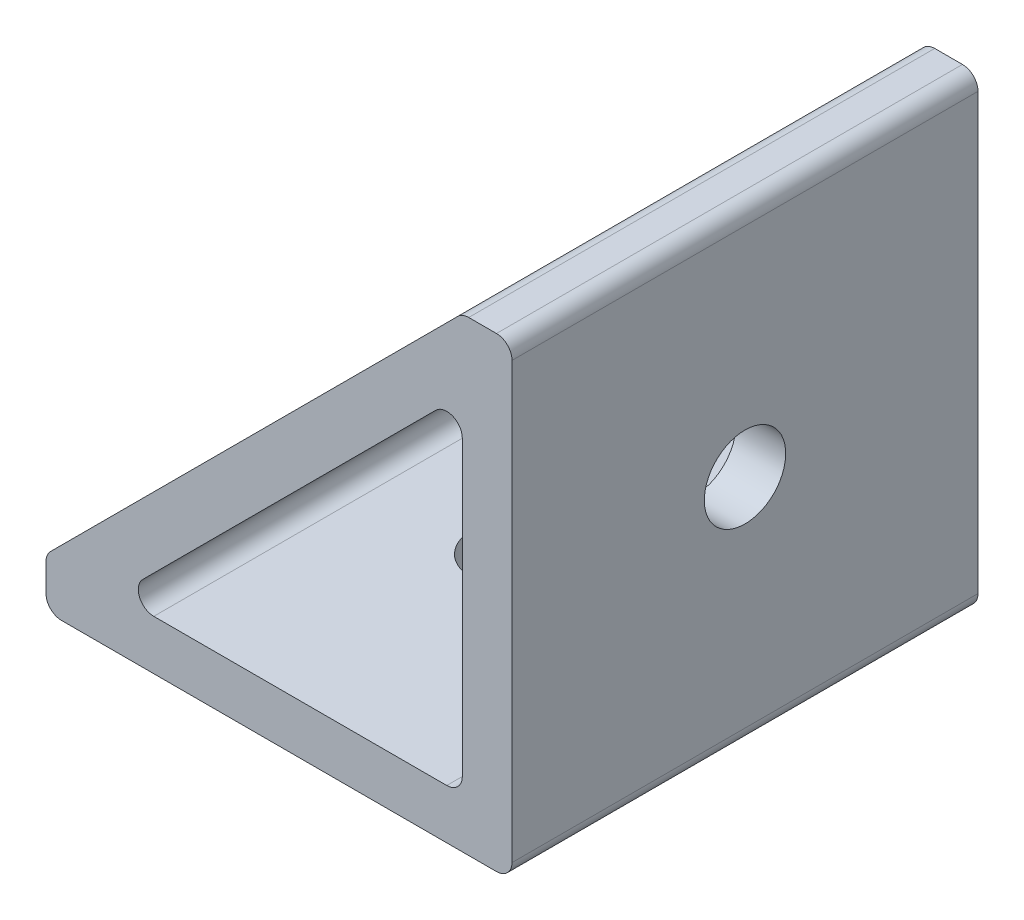
ISO-10303-21;
HEADER;
FILE_DESCRIPTION(('STEP AP214'),'2;1');
FILE_NAME('part.step','',(''),(''),'','','');
FILE_SCHEMA(('AUTOMOTIVE_DESIGN { 1 0 10303 214 1 1 1 1 }'));
ENDSEC;
DATA;
#1=APPLICATION_CONTEXT('core data for automotive mechanical design processes');
#2=APPLICATION_PROTOCOL_DEFINITION('international standard','automotive_design',2000,#1);
#3=PRODUCT_CONTEXT('',#1,'mechanical');
#4=PRODUCT('Part','Part','',(#3));
#5=PRODUCT_RELATED_PRODUCT_CATEGORY('part','',(#4));
#6=PRODUCT_DEFINITION_FORMATION('','',#4);
#7=PRODUCT_DEFINITION_CONTEXT('part definition',#1,'design');
#8=PRODUCT_DEFINITION('design','',#6,#7);
#9=PRODUCT_DEFINITION_SHAPE('','',#8);
#10=(LENGTH_UNIT() NAMED_UNIT(*) SI_UNIT(.MILLI.,.METRE.));
#11=(NAMED_UNIT(*) PLANE_ANGLE_UNIT() SI_UNIT($,.RADIAN.));
#12=(NAMED_UNIT(*) SI_UNIT($,.STERADIAN.) SOLID_ANGLE_UNIT());
#13=UNCERTAINTY_MEASURE_WITH_UNIT(LENGTH_MEASURE(1.E-05),#10,'distance_accuracy_value','');
#14=(GEOMETRIC_REPRESENTATION_CONTEXT(3) GLOBAL_UNCERTAINTY_ASSIGNED_CONTEXT((#13)) GLOBAL_UNIT_ASSIGNED_CONTEXT((#10,
#11,#12)) REPRESENTATION_CONTEXT('',''));
#15=CARTESIAN_POINT('',(0.,0.,0.));
#16=DIRECTION('',(0.,0.,1.));
#17=DIRECTION('',(1.,0.,0.));
#18=AXIS2_PLACEMENT_3D('',#15,#16,#17);
#19=CARTESIAN_POINT('',(0.,0.,19.05));
#20=DIRECTION('',(0.,0.,1.));
#21=DIRECTION('',(1.,0.,0.));
#22=AXIS2_PLACEMENT_3D('',#19,#20,#21);
#23=PLANE('',#22);
#24=DIRECTION('',(0.,1.,0.));
#25=VECTOR('',#24,1.);
#26=CARTESIAN_POINT('',(0.,0.,19.05));
#27=LINE('',#26,#25);
#28=CARTESIAN_POINT('',(0.,1.27,19.05));
#29=VERTEX_POINT('',#28);
#30=CARTESIAN_POINT('',(0.,36.83,19.05));
#31=VERTEX_POINT('',#30);
#32=EDGE_CURVE('E303',#29,#31,#27,.T.);
#33=ORIENTED_EDGE('',*,*,#32,.T.);
#34=CARTESIAN_POINT('',(-1.27,36.83,19.05));
#35=DIRECTION('',(0.,0.,1.));
#36=DIRECTION('',(1.,0.,0.));
#37=AXIS2_PLACEMENT_3D('',#34,#35,#36);
#38=CIRCLE('',#37,1.27);
#39=CARTESIAN_POINT('',(-1.27,38.1,19.05));
#40=VERTEX_POINT('',#39);
#41=EDGE_CURVE('E357',#31,#40,#38,.T.);
#42=ORIENTED_EDGE('',*,*,#41,.T.);
#43=DIRECTION('',(-1.,0.,0.));
#44=VECTOR('',#43,1.);
#45=CARTESIAN_POINT('',(0.,38.1,19.05));
#46=LINE('',#45,#44);
#47=CARTESIAN_POINT('',(-3.53794877578617,38.1,19.05));
#48=VERTEX_POINT('',#47);
#49=EDGE_CURVE('E307',#40,#48,#46,.T.);
#50=ORIENTED_EDGE('',*,*,#49,.T.);
#51=CARTESIAN_POINT('',(-3.53794877578617,36.83,19.05));
#52=DIRECTION('',(0.,0.,1.));
#53=DIRECTION('',(1.,0.,0.));
#54=AXIS2_PLACEMENT_3D('',#51,#52,#53);
#55=CIRCLE('',#54,1.27);
#56=CARTESIAN_POINT('',(-4.43597438789308,37.7280256121069,19.05));
#57=VERTEX_POINT('',#56);
#58=EDGE_CURVE('E355',#48,#57,#55,.T.);
#59=ORIENTED_EDGE('',*,*,#58,.T.);
#60=DIRECTION('',(-0.707106781186547,-0.707106781186548,0.));
#61=VECTOR('',#60,1.);
#62=CARTESIAN_POINT('',(-4.064,38.1,19.05));
#63=LINE('',#62,#61);
#64=CARTESIAN_POINT('',(-37.7280256121069,4.43597438789307,19.05));
#65=VERTEX_POINT('',#64);
#66=EDGE_CURVE('E310',#57,#65,#63,.T.);
#67=ORIENTED_EDGE('',*,*,#66,.T.);
#68=CARTESIAN_POINT('',(-36.83,3.53794877578617,19.05));
#69=DIRECTION('',(0.,0.,1.));
#70=DIRECTION('',(1.,0.,0.));
#71=AXIS2_PLACEMENT_3D('',#68,#69,#70);
#72=CIRCLE('',#71,1.27);
#73=CARTESIAN_POINT('',(-38.1,3.53794877578617,19.05));
#74=VERTEX_POINT('',#73);
#75=EDGE_CURVE('E353',#65,#74,#72,.T.);
#76=ORIENTED_EDGE('',*,*,#75,.T.);
#77=DIRECTION('',(0.,-1.,0.));
#78=VECTOR('',#77,1.);
#79=CARTESIAN_POINT('',(-38.1,4.064,19.05));
#80=LINE('',#79,#78);
#81=CARTESIAN_POINT('',(-38.1,1.27,19.05));
#82=VERTEX_POINT('',#81);
#83=EDGE_CURVE('E313',#74,#82,#80,.T.);
#84=ORIENTED_EDGE('',*,*,#83,.T.);
#85=CARTESIAN_POINT('',(-36.83,1.27,19.05));
#86=DIRECTION('',(0.,0.,1.));
#87=DIRECTION('',(1.,0.,0.));
#88=AXIS2_PLACEMENT_3D('',#85,#86,#87);
#89=CIRCLE('',#88,1.27);
#90=CARTESIAN_POINT('',(-36.83,0.,19.05));
#91=VERTEX_POINT('',#90);
#92=EDGE_CURVE('E351',#82,#91,#89,.T.);
#93=ORIENTED_EDGE('',*,*,#92,.T.);
#94=DIRECTION('',(1.,0.,0.));
#95=VECTOR('',#94,1.);
#96=CARTESIAN_POINT('',(-38.1,0.,19.05));
#97=LINE('',#96,#95);
#98=CARTESIAN_POINT('',(-1.27000000000001,0.,19.05));
#99=VERTEX_POINT('',#98);
#100=EDGE_CURVE('E300',#91,#99,#97,.T.);
#101=ORIENTED_EDGE('',*,*,#100,.T.);
#102=CARTESIAN_POINT('',(-1.27,1.27,19.05));
#103=DIRECTION('',(0.,0.,1.));
#104=DIRECTION('',(1.,0.,0.));
#105=AXIS2_PLACEMENT_3D('',#102,#103,#104);
#106=CIRCLE('',#105,1.27);
#107=EDGE_CURVE('E349',#99,#29,#106,.T.);
#108=ORIENTED_EDGE('',*,*,#107,.T.);
#109=EDGE_LOOP('',(#33,#42,#50,#59,#67,#76,#84,#93,#101,#108));
#110=FACE_BOUND('',#109,.T.);
#111=DIRECTION('',(-0.707106781186547,-0.707106781186548,0.));
#112=VECTOR('',#111,1.);
#113=CARTESIAN_POINT('',(-4.064,32.3526360825158,19.05));
#114=LINE('',#113,#112);
#115=CARTESIAN_POINT('',(-6.23202561210691,30.1846104704088,19.05));
#116=VERTEX_POINT('',#115);
#117=CARTESIAN_POINT('',(-30.1846104704088,6.23202561210692,19.05));
#118=VERTEX_POINT('',#117);
#119=EDGE_CURVE('E286',#116,#118,#114,.T.);
#120=ORIENTED_EDGE('',*,*,#119,.F.);
#121=CARTESIAN_POINT('',(-5.334,29.2865848583019,19.05));
#122=DIRECTION('',(0.,0.,1.));
#123=DIRECTION('',(1.,0.,0.));
#124=AXIS2_PLACEMENT_3D('',#121,#122,#123);
#125=CIRCLE('',#124,1.27);
#126=CARTESIAN_POINT('',(-4.064,29.2865848583019,19.05));
#127=VERTEX_POINT('',#126);
#128=EDGE_CURVE('E390',#116,#127,#125,.F.);
#129=ORIENTED_EDGE('',*,*,#128,.T.);
#130=DIRECTION('',(0.,1.,0.));
#131=VECTOR('',#130,1.);
#132=CARTESIAN_POINT('',(-4.064,4.064,19.05));
#133=LINE('',#132,#131);
#134=CARTESIAN_POINT('',(-4.064,5.334,19.05));
#135=VERTEX_POINT('',#134);
#136=EDGE_CURVE('E283',#135,#127,#133,.T.);
#137=ORIENTED_EDGE('',*,*,#136,.F.);
#138=CARTESIAN_POINT('',(-5.334,5.334,19.05));
#139=DIRECTION('',(0.,0.,1.));
#140=DIRECTION('',(1.,0.,0.));
#141=AXIS2_PLACEMENT_3D('',#138,#139,#140);
#142=CIRCLE('',#141,1.27);
#143=CARTESIAN_POINT('',(-5.334,4.064,19.05));
#144=VERTEX_POINT('',#143);
#145=EDGE_CURVE('E48',#135,#144,#142,.F.);
#146=ORIENTED_EDGE('',*,*,#145,.T.);
#147=DIRECTION('',(1.,0.,0.));
#148=VECTOR('',#147,1.);
#149=CARTESIAN_POINT('',(-32.3526360825157,4.064,19.05));
#150=LINE('',#149,#148);
#151=CARTESIAN_POINT('',(-29.2865848583019,4.064,19.05));
#152=VERTEX_POINT('',#151);
#153=EDGE_CURVE('E290',#152,#144,#150,.T.);
#154=ORIENTED_EDGE('',*,*,#153,.F.);
#155=CARTESIAN_POINT('',(-29.2865848583019,5.334,19.05));
#156=DIRECTION('',(0.,0.,1.));
#157=DIRECTION('',(1.,0.,0.));
#158=AXIS2_PLACEMENT_3D('',#155,#156,#157);
#159=CIRCLE('',#158,1.27);
#160=EDGE_CURVE('E11',#152,#118,#159,.F.);
#161=ORIENTED_EDGE('',*,*,#160,.T.);
#162=EDGE_LOOP('',(#120,#129,#137,#146,#154,#161));
#163=FACE_BOUND('',#162,.T.);
#164=ADVANCED_FACE('F33',(#110,#163),#23,.T.);
#165=CARTESIAN_POINT('',(0.,0.,-19.05));
#166=DIRECTION('',(0.,0.,1.));
#167=DIRECTION('',(1.,0.,0.));
#168=AXIS2_PLACEMENT_3D('',#165,#166,#167);
#169=PLANE('',#168);
#170=DIRECTION('',(-1.,0.,0.));
#171=VECTOR('',#170,1.);
#172=CARTESIAN_POINT('',(0.,38.1,-19.05));
#173=LINE('',#172,#171);
#174=CARTESIAN_POINT('',(-1.27,38.1,-19.05));
#175=VERTEX_POINT('',#174);
#176=CARTESIAN_POINT('',(-3.53794877578617,38.1,-19.05));
#177=VERTEX_POINT('',#176);
#178=EDGE_CURVE('E322',#175,#177,#173,.T.);
#179=ORIENTED_EDGE('',*,*,#178,.F.);
#180=CARTESIAN_POINT('',(-1.27,36.83,-19.05));
#181=DIRECTION('',(0.,0.,1.));
#182=DIRECTION('',(1.,0.,0.));
#183=AXIS2_PLACEMENT_3D('',#180,#181,#182);
#184=CIRCLE('',#183,1.27);
#185=CARTESIAN_POINT('',(0.,36.83,-19.05));
#186=VERTEX_POINT('',#185);
#187=EDGE_CURVE('E342',#175,#186,#184,.F.);
#188=ORIENTED_EDGE('',*,*,#187,.T.);
#189=DIRECTION('',(0.,1.,0.));
#190=VECTOR('',#189,1.);
#191=CARTESIAN_POINT('',(0.,0.,-19.05));
#192=LINE('',#191,#190);
#193=CARTESIAN_POINT('',(0.,1.27,-19.05));
#194=VERTEX_POINT('',#193);
#195=EDGE_CURVE('E319',#194,#186,#192,.T.);
#196=ORIENTED_EDGE('',*,*,#195,.F.);
#197=CARTESIAN_POINT('',(-1.27,1.27,-19.05));
#198=DIRECTION('',(0.,0.,1.));
#199=DIRECTION('',(1.,0.,0.));
#200=AXIS2_PLACEMENT_3D('',#197,#198,#199);
#201=CIRCLE('',#200,1.27);
#202=CARTESIAN_POINT('',(-1.27000000000001,0.,-19.05));
#203=VERTEX_POINT('',#202);
#204=EDGE_CURVE('E334',#194,#203,#201,.F.);
#205=ORIENTED_EDGE('',*,*,#204,.T.);
#206=DIRECTION('',(1.,0.,0.));
#207=VECTOR('',#206,1.);
#208=CARTESIAN_POINT('',(-38.1,0.,-19.05));
#209=LINE('',#208,#207);
#210=CARTESIAN_POINT('',(-36.83,0.,-19.05));
#211=VERTEX_POINT('',#210);
#212=EDGE_CURVE('E292',#211,#203,#209,.T.);
#213=ORIENTED_EDGE('',*,*,#212,.F.);
#214=CARTESIAN_POINT('',(-36.83,1.27,-19.05));
#215=DIRECTION('',(0.,0.,1.));
#216=DIRECTION('',(1.,0.,0.));
#217=AXIS2_PLACEMENT_3D('',#214,#215,#216);
#218=CIRCLE('',#217,1.27);
#219=CARTESIAN_POINT('',(-38.1,1.27,-19.05));
#220=VERTEX_POINT('',#219);
#221=EDGE_CURVE('E336',#211,#220,#218,.F.);
#222=ORIENTED_EDGE('',*,*,#221,.T.);
#223=DIRECTION('',(0.,-1.,0.));
#224=VECTOR('',#223,1.);
#225=CARTESIAN_POINT('',(-38.1,4.064,-19.05));
#226=LINE('',#225,#224);
#227=CARTESIAN_POINT('',(-38.1,3.53794877578617,-19.05));
#228=VERTEX_POINT('',#227);
#229=EDGE_CURVE('E304',#228,#220,#226,.T.);
#230=ORIENTED_EDGE('',*,*,#229,.F.);
#231=CARTESIAN_POINT('',(-36.83,3.53794877578617,-19.05));
#232=DIRECTION('',(0.,0.,1.));
#233=DIRECTION('',(1.,0.,0.));
#234=AXIS2_PLACEMENT_3D('',#231,#232,#233);
#235=CIRCLE('',#234,1.27);
#236=CARTESIAN_POINT('',(-37.7280256121069,4.43597438789307,-19.05));
#237=VERTEX_POINT('',#236);
#238=EDGE_CURVE('E338',#228,#237,#235,.F.);
#239=ORIENTED_EDGE('',*,*,#238,.T.);
#240=DIRECTION('',(-0.707106781186547,-0.707106781186548,0.));
#241=VECTOR('',#240,1.);
#242=CARTESIAN_POINT('',(-4.064,38.1,-19.05));
#243=LINE('',#242,#241);
#244=CARTESIAN_POINT('',(-4.43597438789308,37.7280256121069,-19.05));
#245=VERTEX_POINT('',#244);
#246=EDGE_CURVE('E325',#245,#237,#243,.T.);
#247=ORIENTED_EDGE('',*,*,#246,.F.);
#248=CARTESIAN_POINT('',(-3.53794877578617,36.83,-19.05));
#249=DIRECTION('',(0.,0.,1.));
#250=DIRECTION('',(1.,0.,0.));
#251=AXIS2_PLACEMENT_3D('',#248,#249,#250);
#252=CIRCLE('',#251,1.27);
#253=EDGE_CURVE('E340',#245,#177,#252,.F.);
#254=ORIENTED_EDGE('',*,*,#253,.T.);
#255=EDGE_LOOP('',(#179,#188,#196,#205,#213,#222,#230,#239,#247,#254));
#256=FACE_BOUND('',#255,.T.);
#257=DIRECTION('',(1.,0.,0.));
#258=VECTOR('',#257,1.);
#259=CARTESIAN_POINT('',(-32.3526360825157,4.064,-19.05));
#260=LINE('',#259,#258);
#261=CARTESIAN_POINT('',(-29.2865848583019,4.064,-19.05));
#262=VERTEX_POINT('',#261);
#263=CARTESIAN_POINT('',(-5.334,4.064,-19.05));
#264=VERTEX_POINT('',#263);
#265=EDGE_CURVE('E287',#262,#264,#260,.T.);
#266=ORIENTED_EDGE('',*,*,#265,.T.);
#267=CARTESIAN_POINT('',(-5.334,5.334,-19.05));
#268=DIRECTION('',(0.,0.,1.));
#269=DIRECTION('',(1.,0.,0.));
#270=AXIS2_PLACEMENT_3D('',#267,#268,#269);
#271=CIRCLE('',#270,1.27);
#272=CARTESIAN_POINT('',(-4.064,5.334,-19.05));
#273=VERTEX_POINT('',#272);
#274=EDGE_CURVE('E392',#264,#273,#271,.T.);
#275=ORIENTED_EDGE('',*,*,#274,.T.);
#276=DIRECTION('',(0.,1.,0.));
#277=VECTOR('',#276,1.);
#278=CARTESIAN_POINT('',(-4.064,4.064,-19.05));
#279=LINE('',#278,#277);
#280=CARTESIAN_POINT('',(-4.064,29.2865848583019,-19.05));
#281=VERTEX_POINT('',#280);
#282=EDGE_CURVE('E282',#273,#281,#279,.T.);
#283=ORIENTED_EDGE('',*,*,#282,.T.);
#284=CARTESIAN_POINT('',(-5.334,29.2865848583019,-19.05));
#285=DIRECTION('',(0.,0.,1.));
#286=DIRECTION('',(1.,0.,0.));
#287=AXIS2_PLACEMENT_3D('',#284,#285,#286);
#288=CIRCLE('',#287,1.27);
#289=CARTESIAN_POINT('',(-6.23202561210691,30.1846104704088,-19.05));
#290=VERTEX_POINT('',#289);
#291=EDGE_CURVE('E388',#281,#290,#288,.T.);
#292=ORIENTED_EDGE('',*,*,#291,.T.);
#293=DIRECTION('',(-0.707106781186547,-0.707106781186548,0.));
#294=VECTOR('',#293,1.);
#295=CARTESIAN_POINT('',(-4.064,32.3526360825158,-19.05));
#296=LINE('',#295,#294);
#297=CARTESIAN_POINT('',(-30.1846104704088,6.23202561210692,-19.05));
#298=VERTEX_POINT('',#297);
#299=EDGE_CURVE('E295',#290,#298,#296,.T.);
#300=ORIENTED_EDGE('',*,*,#299,.T.);
#301=CARTESIAN_POINT('',(-29.2865848583019,5.334,-19.05));
#302=DIRECTION('',(0.,0.,1.));
#303=DIRECTION('',(1.,0.,0.));
#304=AXIS2_PLACEMENT_3D('',#301,#302,#303);
#305=CIRCLE('',#304,1.27);
#306=EDGE_CURVE('E41',#298,#262,#305,.T.);
#307=ORIENTED_EDGE('',*,*,#306,.T.);
#308=EDGE_LOOP('',(#266,#275,#283,#292,#300,#307));
#309=FACE_BOUND('',#308,.T.);
#310=ADVANCED_FACE('F395',(#256,#309),#169,.F.);
#311=CARTESIAN_POINT('',(-38.1,0.,19.05));
#312=DIRECTION('',(0.,1.,0.));
#313=DIRECTION('',(0.,0.,1.));
#314=AXIS2_PLACEMENT_3D('',#311,#312,#313);
#315=PLANE('',#314);
#316=CARTESIAN_POINT('',(-19.05,0.,0.));
#317=DIRECTION('',(0.,-1.,0.));
#318=DIRECTION('',(0.,0.,-1.));
#319=AXIS2_PLACEMENT_3D('',#316,#317,#318);
#320=CIRCLE('',#319,3.3274);
#321=CARTESIAN_POINT('',(-19.05,0.,-3.3274));
#322=VERTEX_POINT('',#321);
#323=EDGE_CURVE('E271',#322,#322,#320,.T.);
#324=ORIENTED_EDGE('',*,*,#323,.F.);
#325=EDGE_LOOP('',(#324));
#326=FACE_BOUND('',#325,.T.);
#327=ORIENTED_EDGE('',*,*,#100,.F.);
#328=DIRECTION('',(0.,0.,-1.));
#329=VECTOR('',#328,1.);
#330=CARTESIAN_POINT('',(-36.83,0.,19.05));
#331=LINE('',#330,#329);
#332=EDGE_CURVE('E371',#91,#211,#331,.T.);
#333=ORIENTED_EDGE('',*,*,#332,.T.);
#334=ORIENTED_EDGE('',*,*,#212,.T.);
#335=DIRECTION('',(0.,0.,-1.));
#336=VECTOR('',#335,1.);
#337=CARTESIAN_POINT('',(-1.27,0.,19.05));
#338=LINE('',#337,#336);
#339=EDGE_CURVE('E369',#203,#99,#338,.F.);
#340=ORIENTED_EDGE('',*,*,#339,.T.);
#341=EDGE_LOOP('',(#327,#333,#334,#340));
#342=FACE_BOUND('',#341,.T.);
#343=ADVANCED_FACE('F427',(#326,#342),#315,.F.);
#344=CARTESIAN_POINT('',(0.,0.,19.05));
#345=DIRECTION('',(-1.,0.,0.));
#346=DIRECTION('',(0.,-1.,0.));
#347=AXIS2_PLACEMENT_3D('',#344,#345,#346);
#348=PLANE('',#347);
#349=CARTESIAN_POINT('',(0.,19.05,0.));
#350=DIRECTION('',(1.,0.,0.));
#351=DIRECTION('',(0.,1.,0.));
#352=AXIS2_PLACEMENT_3D('',#349,#350,#351);
#353=CIRCLE('',#352,3.3274);
#354=CARTESIAN_POINT('',(0.,22.3774,0.));
#355=VERTEX_POINT('',#354);
#356=EDGE_CURVE('E279',#355,#355,#353,.T.);
#357=ORIENTED_EDGE('',*,*,#356,.F.);
#358=EDGE_LOOP('',(#357));
#359=FACE_BOUND('',#358,.T.);
#360=ORIENTED_EDGE('',*,*,#195,.T.);
#361=DIRECTION('',(0.,0.,-1.));
#362=VECTOR('',#361,1.);
#363=CARTESIAN_POINT('',(0.,36.83,19.05));
#364=LINE('',#363,#362);
#365=EDGE_CURVE('E347',#186,#31,#364,.F.);
#366=ORIENTED_EDGE('',*,*,#365,.T.);
#367=ORIENTED_EDGE('',*,*,#32,.F.);
#368=DIRECTION('',(0.,0.,-1.));
#369=VECTOR('',#368,1.);
#370=CARTESIAN_POINT('',(0.,1.27,19.05));
#371=LINE('',#370,#369);
#372=EDGE_CURVE('E344',#29,#194,#371,.T.);
#373=ORIENTED_EDGE('',*,*,#372,.T.);
#374=EDGE_LOOP('',(#360,#366,#367,#373));
#375=FACE_BOUND('',#374,.T.);
#376=ADVANCED_FACE('F444',(#359,#375),#348,.F.);
#377=CARTESIAN_POINT('',(0.,38.1,19.05));
#378=DIRECTION('',(0.,-1.,0.));
#379=DIRECTION('',(0.,0.,-1.));
#380=AXIS2_PLACEMENT_3D('',#377,#378,#379);
#381=PLANE('',#380);
#382=ORIENTED_EDGE('',*,*,#49,.F.);
#383=DIRECTION('',(0.,0.,-1.));
#384=VECTOR('',#383,1.);
#385=CARTESIAN_POINT('',(-1.27,38.1,19.05));
#386=LINE('',#385,#384);
#387=EDGE_CURVE('E331',#40,#175,#386,.T.);
#388=ORIENTED_EDGE('',*,*,#387,.T.);
#389=ORIENTED_EDGE('',*,*,#178,.T.);
#390=DIRECTION('',(0.,0.,-1.));
#391=VECTOR('',#390,1.);
#392=CARTESIAN_POINT('',(-3.53794877578617,38.1,19.05));
#393=LINE('',#392,#391);
#394=EDGE_CURVE('E316',#177,#48,#393,.F.);
#395=ORIENTED_EDGE('',*,*,#394,.T.);
#396=EDGE_LOOP('',(#382,#388,#389,#395));
#397=FACE_BOUND('',#396,.T.);
#398=ADVANCED_FACE('F440',(#397),#381,.F.);
#399=CARTESIAN_POINT('',(-4.064,38.1,19.05));
#400=DIRECTION('',(0.707106781186548,-0.707106781186547,0.));
#401=DIRECTION('',(0.707106781186547,0.707106781186548,0.));
#402=AXIS2_PLACEMENT_3D('',#399,#400,#401);
#403=PLANE('',#402);
#404=CARTESIAN_POINT('',(-14.840307345283,27.323692654717,-3.81));
#405=DIRECTION('',(-0.707106781186548,0.707106781186547,0.));
#406=DIRECTION('',(0.707106781186547,0.707106781186548,0.));
#407=AXIS2_PLACEMENT_3D('',#404,#405,#406);
#408=CIRCLE('',#407,7.62);
#409=CARTESIAN_POINT('',(-9.45215367264149,32.7118463273585,-3.81));
#410=VERTEX_POINT('',#409);
#411=CARTESIAN_POINT('',(-14.840307345283,27.323692654717,-11.43));
#412=VERTEX_POINT('',#411);
#413=EDGE_CURVE('E212',#410,#412,#408,.T.);
#414=ORIENTED_EDGE('',*,*,#413,.F.);
#415=DIRECTION('',(0.,0.,-1.));
#416=VECTOR('',#415,1.);
#417=CARTESIAN_POINT('',(-9.45215367264149,32.7118463273585,3.81));
#418=LINE('',#417,#416);
#419=CARTESIAN_POINT('',(-9.45215367264149,32.7118463273585,3.81));
#420=VERTEX_POINT('',#419);
#421=EDGE_CURVE('E239',#420,#410,#418,.T.);
#422=ORIENTED_EDGE('',*,*,#421,.F.);
#423=CARTESIAN_POINT('',(-14.840307345283,27.323692654717,3.81));
#424=DIRECTION('',(-0.707106781186548,0.707106781186547,0.));
#425=DIRECTION('',(-0.707106781186547,-0.707106781186548,0.));
#426=AXIS2_PLACEMENT_3D('',#423,#424,#425);
#427=CIRCLE('',#426,7.62);
#428=CARTESIAN_POINT('',(-14.840307345283,27.323692654717,11.43));
#429=VERTEX_POINT('',#428);
#430=EDGE_CURVE('E236',#429,#420,#427,.T.);
#431=ORIENTED_EDGE('',*,*,#430,.F.);
#432=DIRECTION('',(0.707106781186548,0.707106781186548,0.));
#433=VECTOR('',#432,1.);
#434=CARTESIAN_POINT('',(-27.323692654717,14.840307345283,11.43));
#435=LINE('',#434,#433);
#436=CARTESIAN_POINT('',(-27.323692654717,14.840307345283,11.43));
#437=VERTEX_POINT('',#436);
#438=EDGE_CURVE('E254',#437,#429,#435,.T.);
#439=ORIENTED_EDGE('',*,*,#438,.F.);
#440=CARTESIAN_POINT('',(-27.323692654717,14.840307345283,3.81));
#441=DIRECTION('',(-0.707106781186548,0.707106781186547,0.));
#442=DIRECTION('',(0.707106781186547,0.707106781186548,0.));
#443=AXIS2_PLACEMENT_3D('',#440,#441,#442);
#444=CIRCLE('',#443,7.62);
#445=CARTESIAN_POINT('',(-32.7118463273585,9.4521536726415,3.81));
#446=VERTEX_POINT('',#445);
#447=EDGE_CURVE('E251',#446,#437,#444,.T.);
#448=ORIENTED_EDGE('',*,*,#447,.F.);
#449=DIRECTION('',(0.,0.,1.));
#450=VECTOR('',#449,1.);
#451=CARTESIAN_POINT('',(-32.7118463273585,9.4521536726415,-3.81));
#452=LINE('',#451,#450);
#453=CARTESIAN_POINT('',(-32.7118463273585,9.4521536726415,-3.81));
#454=VERTEX_POINT('',#453);
#455=EDGE_CURVE('E248',#454,#446,#452,.T.);
#456=ORIENTED_EDGE('',*,*,#455,.F.);
#457=CARTESIAN_POINT('',(-27.323692654717,14.840307345283,-3.81));
#458=DIRECTION('',(-0.707106781186548,0.707106781186547,0.));
#459=DIRECTION('',(-0.707106781186547,-0.707106781186548,0.));
#460=AXIS2_PLACEMENT_3D('',#457,#458,#459);
#461=CIRCLE('',#460,7.62);
#462=CARTESIAN_POINT('',(-27.323692654717,14.840307345283,-11.43));
#463=VERTEX_POINT('',#462);
#464=EDGE_CURVE('E245',#463,#454,#461,.T.);
#465=ORIENTED_EDGE('',*,*,#464,.F.);
#466=DIRECTION('',(-0.707106781186548,-0.707106781186548,0.));
#467=VECTOR('',#466,1.);
#468=CARTESIAN_POINT('',(-14.840307345283,27.323692654717,-11.43));
#469=LINE('',#468,#467);
#470=EDGE_CURVE('E243',#412,#463,#469,.T.);
#471=ORIENTED_EDGE('',*,*,#470,.F.);
#472=EDGE_LOOP('',(#414,#422,#431,#439,#448,#456,#465,#471));
#473=FACE_BOUND('',#472,.T.);
#474=ORIENTED_EDGE('',*,*,#66,.F.);
#475=DIRECTION('',(0.,0.,-1.));
#476=VECTOR('',#475,1.);
#477=CARTESIAN_POINT('',(-4.43597438789308,37.7280256121069,19.05));
#478=LINE('',#477,#476);
#479=EDGE_CURVE('E361',#57,#245,#478,.T.);
#480=ORIENTED_EDGE('',*,*,#479,.T.);
#481=ORIENTED_EDGE('',*,*,#246,.T.);
#482=DIRECTION('',(0.,0.,-1.));
#483=VECTOR('',#482,1.);
#484=CARTESIAN_POINT('',(-37.7280256121069,4.43597438789309,19.05));
#485=LINE('',#484,#483);
#486=EDGE_CURVE('E359',#237,#65,#485,.F.);
#487=ORIENTED_EDGE('',*,*,#486,.T.);
#488=EDGE_LOOP('',(#474,#480,#481,#487));
#489=FACE_BOUND('',#488,.T.);
#490=ADVANCED_FACE('F436',(#473,#489),#403,.F.);
#491=CARTESIAN_POINT('',(-38.1,4.064,19.05));
#492=DIRECTION('',(1.,0.,0.));
#493=DIRECTION('',(0.,0.,-1.));
#494=AXIS2_PLACEMENT_3D('',#491,#492,#493);
#495=PLANE('',#494);
#496=ORIENTED_EDGE('',*,*,#83,.F.);
#497=DIRECTION('',(0.,0.,-1.));
#498=VECTOR('',#497,1.);
#499=CARTESIAN_POINT('',(-38.1,3.53794877578617,19.05));
#500=LINE('',#499,#498);
#501=EDGE_CURVE('E366',#74,#228,#500,.T.);
#502=ORIENTED_EDGE('',*,*,#501,.T.);
#503=ORIENTED_EDGE('',*,*,#229,.T.);
#504=DIRECTION('',(0.,0.,-1.));
#505=VECTOR('',#504,1.);
#506=CARTESIAN_POINT('',(-38.1,1.27,19.05));
#507=LINE('',#506,#505);
#508=EDGE_CURVE('E364',#220,#82,#507,.F.);
#509=ORIENTED_EDGE('',*,*,#508,.T.);
#510=EDGE_LOOP('',(#496,#502,#503,#509));
#511=FACE_BOUND('',#510,.T.);
#512=ADVANCED_FACE('F433',(#511),#495,.F.);
#513=CARTESIAN_POINT('',(-4.064,4.064,19.05));
#514=DIRECTION('',(-1.,0.,0.));
#515=DIRECTION('',(0.,-1.,0.));
#516=AXIS2_PLACEMENT_3D('',#513,#514,#515);
#517=PLANE('',#516);
#518=CARTESIAN_POINT('',(-4.064,19.05,0.));
#519=DIRECTION('',(-1.,0.,0.));
#520=DIRECTION('',(0.,-1.,0.));
#521=AXIS2_PLACEMENT_3D('',#518,#519,#520);
#522=CIRCLE('',#521,3.3274);
#523=CARTESIAN_POINT('',(-4.064,15.7226,0.));
#524=VERTEX_POINT('',#523);
#525=EDGE_CURVE('E274',#524,#524,#522,.F.);
#526=ORIENTED_EDGE('',*,*,#525,.T.);
#527=EDGE_LOOP('',(#526));
#528=FACE_BOUND('',#527,.T.);
#529=ORIENTED_EDGE('',*,*,#136,.T.);
#530=DIRECTION('',(0.,0.,-1.));
#531=VECTOR('',#530,1.);
#532=CARTESIAN_POINT('',(-4.064,29.2865848583019,-19.05));
#533=LINE('',#532,#531);
#534=EDGE_CURVE('E376',#127,#281,#533,.T.);
#535=ORIENTED_EDGE('',*,*,#534,.T.);
#536=ORIENTED_EDGE('',*,*,#282,.F.);
#537=DIRECTION('',(0.,0.,-1.));
#538=VECTOR('',#537,1.);
#539=CARTESIAN_POINT('',(-4.064,5.334,19.05));
#540=LINE('',#539,#538);
#541=EDGE_CURVE('E374',#273,#135,#540,.F.);
#542=ORIENTED_EDGE('',*,*,#541,.T.);
#543=EDGE_LOOP('',(#529,#535,#536,#542));
#544=FACE_BOUND('',#543,.T.);
#545=ADVANCED_FACE('F409',(#528,#544),#517,.T.);
#546=CARTESIAN_POINT('',(-4.064,32.3526360825158,19.05));
#547=DIRECTION('',(0.707106781186548,-0.707106781186547,0.));
#548=DIRECTION('',(0.707106781186547,0.707106781186548,0.));
#549=AXIS2_PLACEMENT_3D('',#546,#547,#548);
#550=PLANE('',#549);
#551=DIRECTION('',(0.,0.,-1.));
#552=VECTOR('',#551,1.);
#553=CARTESIAN_POINT('',(-6.57847171389936,29.8381643686164,3.81));
#554=LINE('',#553,#552);
#555=CARTESIAN_POINT('',(-6.57847171389936,29.8381643686164,3.81));
#556=VERTEX_POINT('',#555);
#557=CARTESIAN_POINT('',(-6.57847171389935,29.8381643686164,-3.81));
#558=VERTEX_POINT('',#557);
#559=EDGE_CURVE('E221',#556,#558,#554,.T.);
#560=ORIENTED_EDGE('',*,*,#559,.T.);
#561=CARTESIAN_POINT('',(-11.9666253865408,24.4500106959749,-3.81));
#562=DIRECTION('',(0.707106781186548,-0.707106781186547,0.));
#563=DIRECTION('',(0.707106781186547,0.707106781186548,0.));
#564=AXIS2_PLACEMENT_3D('',#561,#562,#563);
#565=CIRCLE('',#564,7.62);
#566=CARTESIAN_POINT('',(-11.9666253865408,24.4500106959749,-11.43));
#567=VERTEX_POINT('',#566);
#568=EDGE_CURVE('E206',#558,#567,#565,.F.);
#569=ORIENTED_EDGE('',*,*,#568,.T.);
#570=DIRECTION('',(-0.707106781186547,-0.707106781186548,0.));
#571=VECTOR('',#570,1.);
#572=CARTESIAN_POINT('',(-11.9666253865408,24.4500106959749,-11.43));
#573=LINE('',#572,#571);
#574=CARTESIAN_POINT('',(-24.4500106959749,11.9666253865409,-11.43));
#575=VERTEX_POINT('',#574);
#576=EDGE_CURVE('E195',#567,#575,#573,.T.);
#577=ORIENTED_EDGE('',*,*,#576,.T.);
#578=CARTESIAN_POINT('',(-24.4500106959749,11.9666253865409,-3.81));
#579=DIRECTION('',(0.707106781186548,-0.707106781186547,0.));
#580=DIRECTION('',(0.707106781186547,0.707106781186548,0.));
#581=AXIS2_PLACEMENT_3D('',#578,#579,#580);
#582=CIRCLE('',#581,7.62);
#583=CARTESIAN_POINT('',(-29.8381643686164,6.57847171389937,-3.81));
#584=VERTEX_POINT('',#583);
#585=EDGE_CURVE('E205',#575,#584,#582,.F.);
#586=ORIENTED_EDGE('',*,*,#585,.T.);
#587=DIRECTION('',(0.,0.,1.));
#588=VECTOR('',#587,1.);
#589=CARTESIAN_POINT('',(-29.8381643686164,6.57847171389937,-3.81));
#590=LINE('',#589,#588);
#591=CARTESIAN_POINT('',(-29.8381643686164,6.57847171389937,3.81));
#592=VERTEX_POINT('',#591);
#593=EDGE_CURVE('E225',#584,#592,#590,.T.);
#594=ORIENTED_EDGE('',*,*,#593,.T.);
#595=CARTESIAN_POINT('',(-24.4500106959749,11.9666253865409,3.81));
#596=DIRECTION('',(0.707106781186548,-0.707106781186547,0.));
#597=DIRECTION('',(0.707106781186547,0.707106781186548,0.));
#598=AXIS2_PLACEMENT_3D('',#595,#596,#597);
#599=CIRCLE('',#598,7.62);
#600=CARTESIAN_POINT('',(-24.4500106959749,11.9666253865409,11.43));
#601=VERTEX_POINT('',#600);
#602=EDGE_CURVE('E228',#592,#601,#599,.F.);
#603=ORIENTED_EDGE('',*,*,#602,.T.);
#604=DIRECTION('',(0.707106781186547,0.707106781186548,0.));
#605=VECTOR('',#604,1.);
#606=CARTESIAN_POINT('',(-24.4500106959749,11.9666253865409,11.43));
#607=LINE('',#606,#605);
#608=CARTESIAN_POINT('',(-11.9666253865408,24.4500106959749,11.43));
#609=VERTEX_POINT('',#608);
#610=EDGE_CURVE('E231',#601,#609,#607,.T.);
#611=ORIENTED_EDGE('',*,*,#610,.T.);
#612=CARTESIAN_POINT('',(-11.9666253865408,24.4500106959749,3.81));
#613=DIRECTION('',(0.707106781186548,-0.707106781186547,0.));
#614=DIRECTION('',(0.707106781186547,0.707106781186548,0.));
#615=AXIS2_PLACEMENT_3D('',#612,#613,#614);
#616=CIRCLE('',#615,7.62);
#617=EDGE_CURVE('E234',#609,#556,#616,.F.);
#618=ORIENTED_EDGE('',*,*,#617,.T.);
#619=EDGE_LOOP('',(#560,#569,#577,#586,#594,#603,#611,#618));
#620=FACE_BOUND('',#619,.T.);
#621=ORIENTED_EDGE('',*,*,#299,.F.);
#622=DIRECTION('',(0.,0.,-1.));
#623=VECTOR('',#622,1.);
#624=CARTESIAN_POINT('',(-6.23202561210691,30.1846104704088,19.05));
#625=LINE('',#624,#623);
#626=EDGE_CURVE('E382',#290,#116,#625,.F.);
#627=ORIENTED_EDGE('',*,*,#626,.T.);
#628=ORIENTED_EDGE('',*,*,#119,.T.);
#629=DIRECTION('',(0.,0.,-1.));
#630=VECTOR('',#629,1.);
#631=CARTESIAN_POINT('',(-30.1846104704088,6.23202561210692,-19.05));
#632=LINE('',#631,#630);
#633=EDGE_CURVE('E379',#118,#298,#632,.T.);
#634=ORIENTED_EDGE('',*,*,#633,.T.);
#635=EDGE_LOOP('',(#621,#627,#628,#634));
#636=FACE_BOUND('',#635,.T.);
#637=ADVANCED_FACE('F217',(#620,#636),#550,.T.);
#638=CARTESIAN_POINT('',(-32.3526360825157,4.064,19.05));
#639=DIRECTION('',(0.,1.,0.));
#640=DIRECTION('',(-1.,0.,0.));
#641=AXIS2_PLACEMENT_3D('',#638,#639,#640);
#642=PLANE('',#641);
#643=CARTESIAN_POINT('',(-19.05,4.06400000000001,0.));
#644=DIRECTION('',(0.,1.,0.));
#645=DIRECTION('',(-1.,0.,0.));
#646=AXIS2_PLACEMENT_3D('',#643,#644,#645);
#647=CIRCLE('',#646,3.3274);
#648=CARTESIAN_POINT('',(-19.05,4.06400000000001,-3.3274));
#649=VERTEX_POINT('',#648);
#650=EDGE_CURVE('E270',#649,#649,#647,.F.);
#651=ORIENTED_EDGE('',*,*,#650,.T.);
#652=EDGE_LOOP('',(#651));
#653=FACE_BOUND('',#652,.T.);
#654=ORIENTED_EDGE('',*,*,#153,.T.);
#655=DIRECTION('',(0.,0.,-1.));
#656=VECTOR('',#655,1.);
#657=CARTESIAN_POINT('',(-5.334,4.064,-19.05));
#658=LINE('',#657,#656);
#659=EDGE_CURVE('E385',#144,#264,#658,.T.);
#660=ORIENTED_EDGE('',*,*,#659,.T.);
#661=ORIENTED_EDGE('',*,*,#265,.F.);
#662=DIRECTION('',(0.,0.,-1.));
#663=VECTOR('',#662,1.);
#664=CARTESIAN_POINT('',(-29.2865848583019,4.064,19.05));
#665=LINE('',#664,#663);
#666=EDGE_CURVE('E55',#262,#152,#665,.F.);
#667=ORIENTED_EDGE('',*,*,#666,.T.);
#668=EDGE_LOOP('',(#654,#660,#661,#667));
#669=FACE_BOUND('',#668,.T.);
#670=ADVANCED_FACE('F399',(#653,#669),#642,.T.);
#671=CARTESIAN_POINT('',(-38.101,19.05,0.));
#672=DIRECTION('',(1.,0.,0.));
#673=DIRECTION('',(0.,1.,0.));
#674=AXIS2_PLACEMENT_3D('',#671,#672,#673);
#675=CYLINDRICAL_SURFACE('',#674,3.3274);
#676=ORIENTED_EDGE('',*,*,#525,.F.);
#677=EDGE_LOOP('',(#676));
#678=FACE_BOUND('',#677,.T.);
#679=ORIENTED_EDGE('',*,*,#356,.T.);
#680=EDGE_LOOP('',(#679));
#681=FACE_BOUND('',#680,.T.);
#682=ADVANCED_FACE('F617',(#678,#681),#675,.F.);
#683=CARTESIAN_POINT('',(-19.05,38.101,0.));
#684=DIRECTION('',(0.,-1.,0.));
#685=DIRECTION('',(0.,0.,-1.));
#686=AXIS2_PLACEMENT_3D('',#683,#684,#685);
#687=CYLINDRICAL_SURFACE('',#686,3.3274);
#688=CARTESIAN_POINT('',(-19.05,4.06400000000001,-3.3274));
#689=CARTESIAN_POINT('',(-19.05,4.02166666666667,-3.3274));
#690=CARTESIAN_POINT('',(-19.05,3.97933333333334,-3.3274));
#691=CARTESIAN_POINT('',(-19.05,3.89466666666667,-3.3274));
#692=CARTESIAN_POINT('',(-19.05,3.85233333333334,-3.3274));
#693=CARTESIAN_POINT('',(-19.05,3.76766666666667,-3.3274));
#694=CARTESIAN_POINT('',(-19.05,3.72533333333334,-3.3274));
#695=CARTESIAN_POINT('',(-19.05,3.64066666666667,-3.3274));
#696=CARTESIAN_POINT('',(-19.05,3.59833333333334,-3.3274));
#697=CARTESIAN_POINT('',(-19.05,3.51366666666667,-3.3274));
#698=CARTESIAN_POINT('',(-19.05,3.47133333333334,-3.3274));
#699=CARTESIAN_POINT('',(-19.05,3.38666666666667,-3.3274));
#700=CARTESIAN_POINT('',(-19.05,3.34433333333334,-3.3274));
#701=CARTESIAN_POINT('',(-19.05,3.25966666666667,-3.3274));
#702=CARTESIAN_POINT('',(-19.05,3.21733333333334,-3.3274));
#703=CARTESIAN_POINT('',(-19.05,3.13266666666667,-3.3274));
#704=CARTESIAN_POINT('',(-19.05,3.09033333333334,-3.3274));
#705=CARTESIAN_POINT('',(-19.05,3.00566666666667,-3.3274));
#706=CARTESIAN_POINT('',(-19.05,2.96333333333334,-3.3274));
#707=CARTESIAN_POINT('',(-19.05,2.87866666666667,-3.3274));
#708=CARTESIAN_POINT('',(-19.05,2.83633333333334,-3.3274));
#709=CARTESIAN_POINT('',(-19.05,2.75166666666667,-3.3274));
#710=CARTESIAN_POINT('',(-19.05,2.70933333333334,-3.3274));
#711=CARTESIAN_POINT('',(-19.05,2.62466666666667,-3.3274));
#712=CARTESIAN_POINT('',(-19.05,2.58233333333334,-3.3274));
#713=CARTESIAN_POINT('',(-19.05,2.49766666666667,-3.3274));
#714=CARTESIAN_POINT('',(-19.05,2.45533333333334,-3.3274));
#715=CARTESIAN_POINT('',(-19.05,2.37066666666667,-3.3274));
#716=CARTESIAN_POINT('',(-19.05,2.32833333333334,-3.3274));
#717=CARTESIAN_POINT('',(-19.05,2.24366666666667,-3.3274));
#718=CARTESIAN_POINT('',(-19.05,2.20133333333334,-3.3274));
#719=CARTESIAN_POINT('',(-19.05,2.11666666666667,-3.3274));
#720=CARTESIAN_POINT('',(-19.05,2.07433333333334,-3.3274));
#721=CARTESIAN_POINT('',(-19.05,1.98966666666667,-3.3274));
#722=CARTESIAN_POINT('',(-19.05,1.94733333333334,-3.3274));
#723=CARTESIAN_POINT('',(-19.05,1.86266666666667,-3.3274));
#724=CARTESIAN_POINT('',(-19.05,1.82033333333334,-3.3274));
#725=CARTESIAN_POINT('',(-19.05,1.73566666666667,-3.3274));
#726=CARTESIAN_POINT('',(-19.05,1.69333333333334,-3.3274));
#727=CARTESIAN_POINT('',(-19.05,1.60866666666667,-3.3274));
#728=CARTESIAN_POINT('',(-19.05,1.56633333333334,-3.3274));
#729=CARTESIAN_POINT('',(-19.05,1.48166666666667,-3.3274));
#730=CARTESIAN_POINT('',(-19.05,1.43933333333334,-3.3274));
#731=CARTESIAN_POINT('',(-19.05,1.35466666666668,-3.3274));
#732=CARTESIAN_POINT('',(-19.05,1.31233333333334,-3.3274));
#733=CARTESIAN_POINT('',(-19.05,1.22766666666667,-3.3274));
#734=CARTESIAN_POINT('',(-19.05,1.18533333333334,-3.3274));
#735=CARTESIAN_POINT('',(-19.05,1.10066666666667,-3.3274));
#736=CARTESIAN_POINT('',(-19.05,1.05833333333334,-3.3274));
#737=CARTESIAN_POINT('',(-19.05,0.973666666666676,-3.3274));
#738=CARTESIAN_POINT('',(-19.05,0.931333333333342,-3.3274));
#739=CARTESIAN_POINT('',(-19.05,0.846666666666674,-3.3274));
#740=CARTESIAN_POINT('',(-19.05,0.80433333333334,-3.3274));
#741=CARTESIAN_POINT('',(-19.05,0.719666666666672,-3.3274));
#742=CARTESIAN_POINT('',(-19.05,0.677333333333338,-3.3274));
#743=CARTESIAN_POINT('',(-19.05,0.592666666666672,-3.3274));
#744=CARTESIAN_POINT('',(-19.05,0.55033333333334,-3.3274));
#745=CARTESIAN_POINT('',(-19.05,0.465666666666674,-3.3274));
#746=CARTESIAN_POINT('',(-19.05,0.42333333333334,-3.3274));
#747=CARTESIAN_POINT('',(-19.05,0.338666666666672,-3.3274));
#748=CARTESIAN_POINT('',(-19.05,0.296333333333338,-3.3274));
#749=CARTESIAN_POINT('',(-19.05,0.211666666666672,-3.3274));
#750=CARTESIAN_POINT('',(-19.05,0.169333333333341,-3.3274));
#751=CARTESIAN_POINT('',(-19.05,0.084666666666675,-3.3274));
#752=CARTESIAN_POINT('',(-19.05,0.042333333333341,-3.3274));
#753=CARTESIAN_POINT('',(-19.05,0.,-3.3274));
#754=B_SPLINE_CURVE_WITH_KNOTS('',3,(#688,#689,#690,#691,#692,#693,#694,#695,#696,#697,#698,
#699,#700,#701,#702,#703,#704,#705,#706,#707,#708,#709,#710,#711,#712,#713,#714,#715,#716,#717,
#718,#719,#720,#721,#722,#723,#724,#725,#726,#727,#728,#729,#730,#731,#732,#733,#734,#735,#736,
#737,#738,#739,#740,#741,#742,#743,#744,#745,#746,#747,#748,#749,#750,#751,#752,#753),
.UNSPECIFIED.,.F.,.F.,(4,2,2,2,2,2,2,2,2,2,2,2,2,2,2,2,2,2,2,2,2,2,2,2,2,2,2,2,2,2,2,2,4),(0.,
0.127000000000002,0.253999999999997,0.380999999999999,0.508000000000002,0.634999999999997,
0.761999999999999,0.889000000000001,1.016,1.143,1.27,1.397,1.524,1.651,1.778,1.905,2.032,2.159,
2.286,2.413,2.54,2.667,2.794,2.921,3.048,3.175,3.302,3.429,3.556,3.683,3.81,3.937,4.064),.UNSPECIFIED.);
#755=EDGE_CURVE('BSEAM608',#649,#322,#754,.T.);
#756=ORIENTED_EDGE('',*,*,#650,.F.);
#757=ORIENTED_EDGE('',*,*,#323,.T.);
#758=ORIENTED_EDGE('',*,*,#755,.T.);
#759=ORIENTED_EDGE('',*,*,#755,.F.);
#760=EDGE_LOOP('',(#756,#758,#757,#759));
#761=FACE_BOUND('',#760,.T.);
#762=ADVANCED_FACE('F608',(#761),#687,.F.);
#763=CARTESIAN_POINT('',(11.6308463273585,11.6288463273585,3.81));
#764=DIRECTION('',(0.707106781186547,0.707106781186548,0.));
#765=DIRECTION('',(-0.707106781186548,0.707106781186547,0.));
#766=AXIS2_PLACEMENT_3D('',#763,#764,#765);
#767=PLANE('',#766);
#768=DIRECTION('',(-0.707106781186548,0.707106781186547,0.));
#769=VECTOR('',#768,1.);
#770=CARTESIAN_POINT('',(11.6308463273585,11.6288463273585,3.81));
#771=LINE('',#770,#769);
#772=EDGE_CURVE('E256',#556,#420,#771,.T.);
#773=ORIENTED_EDGE('',*,*,#772,.T.);
#774=ORIENTED_EDGE('',*,*,#421,.T.);
#775=DIRECTION('',(-0.707106781186548,0.707106781186547,0.));
#776=VECTOR('',#775,1.);
#777=CARTESIAN_POINT('',(11.6308463273585,11.6288463273585,-3.81));
#778=LINE('',#777,#776);
#779=EDGE_CURVE('E214',#558,#410,#778,.T.);
#780=ORIENTED_EDGE('',*,*,#779,.F.);
#781=ORIENTED_EDGE('',*,*,#559,.F.);
#782=EDGE_LOOP('',(#773,#774,#780,#781));
#783=FACE_BOUND('',#782,.T.);
#784=ADVANCED_FACE('F600',(#783),#767,.F.);
#785=CARTESIAN_POINT('',(6.24269265471704,6.24069265471703,-3.81));
#786=DIRECTION('',(-0.707106781186548,0.707106781186547,0.));
#787=DIRECTION('',(-0.707106781186547,-0.707106781186548,0.));
#788=AXIS2_PLACEMENT_3D('',#785,#786,#787);
#789=CYLINDRICAL_SURFACE('',#788,7.62);
#790=ORIENTED_EDGE('',*,*,#779,.T.);
#791=ORIENTED_EDGE('',*,*,#413,.T.);
#792=DIRECTION('',(-0.707106781186548,0.707106781186547,0.));
#793=VECTOR('',#792,1.);
#794=CARTESIAN_POINT('',(6.24269265471704,6.24069265471703,-11.43));
#795=LINE('',#794,#793);
#796=EDGE_CURVE('E199',#567,#412,#795,.T.);
#797=ORIENTED_EDGE('',*,*,#796,.F.);
#798=ORIENTED_EDGE('',*,*,#568,.F.);
#799=EDGE_LOOP('',(#790,#791,#797,#798));
#800=FACE_BOUND('',#799,.T.);
#801=ADVANCED_FACE('F209',(#800),#789,.F.);
#802=CARTESIAN_POINT('',(6.24269265471704,6.24069265471703,-11.43));
#803=DIRECTION('',(0.,0.,-1.));
#804=DIRECTION('',(0.,1.,0.));
#805=AXIS2_PLACEMENT_3D('',#802,#803,#804);
#806=PLANE('',#805);
#807=ORIENTED_EDGE('',*,*,#796,.T.);
#808=ORIENTED_EDGE('',*,*,#470,.T.);
#809=DIRECTION('',(-0.707106781186548,0.707106781186547,0.));
#810=VECTOR('',#809,1.);
#811=CARTESIAN_POINT('',(-6.24069265471701,-6.24269265471702,-11.43));
#812=LINE('',#811,#810);
#813=EDGE_CURVE('E201',#575,#463,#812,.T.);
#814=ORIENTED_EDGE('',*,*,#813,.F.);
#815=ORIENTED_EDGE('',*,*,#576,.F.);
#816=EDGE_LOOP('',(#807,#808,#814,#815));
#817=FACE_BOUND('',#816,.T.);
#818=ADVANCED_FACE('F197',(#817),#806,.F.);
#819=CARTESIAN_POINT('',(-6.24069265471701,-6.24269265471702,-3.81));
#820=DIRECTION('',(-0.707106781186548,0.707106781186547,0.));
#821=DIRECTION('',(-0.707106781186547,-0.707106781186548,0.));
#822=AXIS2_PLACEMENT_3D('',#819,#820,#821);
#823=CYLINDRICAL_SURFACE('',#822,7.62);
#824=ORIENTED_EDGE('',*,*,#813,.T.);
#825=ORIENTED_EDGE('',*,*,#464,.T.);
#826=DIRECTION('',(-0.707106781186548,0.707106781186547,0.));
#827=VECTOR('',#826,1.);
#828=CARTESIAN_POINT('',(-11.6288463273585,-11.6308463273585,-3.81));
#829=LINE('',#828,#827);
#830=EDGE_CURVE('E264',#584,#454,#829,.T.);
#831=ORIENTED_EDGE('',*,*,#830,.F.);
#832=ORIENTED_EDGE('',*,*,#585,.F.);
#833=EDGE_LOOP('',(#824,#825,#831,#832));
#834=FACE_BOUND('',#833,.T.);
#835=ADVANCED_FACE('F576',(#834),#823,.F.);
#836=CARTESIAN_POINT('',(-11.6288463273585,-11.6308463273585,-3.81));
#837=DIRECTION('',(-0.707106781186547,-0.707106781186548,0.));
#838=DIRECTION('',(0.707106781186548,-0.707106781186547,0.));
#839=AXIS2_PLACEMENT_3D('',#836,#837,#838);
#840=PLANE('',#839);
#841=ORIENTED_EDGE('',*,*,#830,.T.);
#842=ORIENTED_EDGE('',*,*,#455,.T.);
#843=DIRECTION('',(-0.707106781186548,0.707106781186547,0.));
#844=VECTOR('',#843,1.);
#845=CARTESIAN_POINT('',(-11.6288463273585,-11.6308463273585,3.81));
#846=LINE('',#845,#844);
#847=EDGE_CURVE('E262',#592,#446,#846,.T.);
#848=ORIENTED_EDGE('',*,*,#847,.F.);
#849=ORIENTED_EDGE('',*,*,#593,.F.);
#850=EDGE_LOOP('',(#841,#842,#848,#849));
#851=FACE_BOUND('',#850,.T.);
#852=ADVANCED_FACE('F567',(#851),#840,.F.);
#853=CARTESIAN_POINT('',(-6.24069265471701,-6.24269265471702,3.81));
#854=DIRECTION('',(-0.707106781186548,0.707106781186547,0.));
#855=DIRECTION('',(-0.707106781186547,-0.707106781186548,0.));
#856=AXIS2_PLACEMENT_3D('',#853,#854,#855);
#857=CYLINDRICAL_SURFACE('',#856,7.62);
#858=ORIENTED_EDGE('',*,*,#847,.T.);
#859=ORIENTED_EDGE('',*,*,#447,.T.);
#860=DIRECTION('',(-0.707106781186548,0.707106781186547,0.));
#861=VECTOR('',#860,1.);
#862=CARTESIAN_POINT('',(-6.24069265471701,-6.24269265471702,11.43));
#863=LINE('',#862,#861);
#864=EDGE_CURVE('E260',#601,#437,#863,.T.);
#865=ORIENTED_EDGE('',*,*,#864,.F.);
#866=ORIENTED_EDGE('',*,*,#602,.F.);
#867=EDGE_LOOP('',(#858,#859,#865,#866));
#868=FACE_BOUND('',#867,.T.);
#869=ADVANCED_FACE('F558',(#868),#857,.F.);
#870=CARTESIAN_POINT('',(-6.24069265471701,-6.24269265471702,11.43));
#871=DIRECTION('',(0.,0.,1.));
#872=DIRECTION('',(0.,-1.,0.));
#873=AXIS2_PLACEMENT_3D('',#870,#871,#872);
#874=PLANE('',#873);
#875=ORIENTED_EDGE('',*,*,#864,.T.);
#876=ORIENTED_EDGE('',*,*,#438,.T.);
#877=DIRECTION('',(-0.707106781186548,0.707106781186547,0.));
#878=VECTOR('',#877,1.);
#879=CARTESIAN_POINT('',(6.24269265471704,6.24069265471703,11.43));
#880=LINE('',#879,#878);
#881=EDGE_CURVE('E257',#609,#429,#880,.T.);
#882=ORIENTED_EDGE('',*,*,#881,.F.);
#883=ORIENTED_EDGE('',*,*,#610,.F.);
#884=EDGE_LOOP('',(#875,#876,#882,#883));
#885=FACE_BOUND('',#884,.T.);
#886=ADVANCED_FACE('F549',(#885),#874,.F.);
#887=CARTESIAN_POINT('',(6.24269265471704,6.24069265471703,3.81));
#888=DIRECTION('',(-0.707106781186548,0.707106781186547,0.));
#889=DIRECTION('',(-0.707106781186547,-0.707106781186548,0.));
#890=AXIS2_PLACEMENT_3D('',#887,#888,#889);
#891=CYLINDRICAL_SURFACE('',#890,7.62);
#892=ORIENTED_EDGE('',*,*,#881,.T.);
#893=ORIENTED_EDGE('',*,*,#430,.T.);
#894=ORIENTED_EDGE('',*,*,#772,.F.);
#895=ORIENTED_EDGE('',*,*,#617,.F.);
#896=EDGE_LOOP('',(#892,#893,#894,#895));
#897=FACE_BOUND('',#896,.T.);
#898=ADVANCED_FACE('F456',(#897),#891,.F.);
#899=CARTESIAN_POINT('',(-1.27,36.83,19.05));
#900=DIRECTION('',(0.,0.,-1.));
#901=DIRECTION('',(-1.,0.,0.));
#902=AXIS2_PLACEMENT_3D('',#899,#900,#901);
#903=CYLINDRICAL_SURFACE('',#902,1.27);
#904=ORIENTED_EDGE('',*,*,#41,.F.);
#905=ORIENTED_EDGE('',*,*,#365,.F.);
#906=ORIENTED_EDGE('',*,*,#187,.F.);
#907=ORIENTED_EDGE('',*,*,#387,.F.);
#908=EDGE_LOOP('',(#904,#905,#906,#907));
#909=FACE_BOUND('',#908,.T.);
#910=ADVANCED_FACE('F452',(#909),#903,.T.);
#911=CARTESIAN_POINT('',(-3.53794877578617,36.83,19.05));
#912=DIRECTION('',(0.,0.,-1.));
#913=DIRECTION('',(-1.,0.,0.));
#914=AXIS2_PLACEMENT_3D('',#911,#912,#913);
#915=CYLINDRICAL_SURFACE('',#914,1.27);
#916=ORIENTED_EDGE('',*,*,#58,.F.);
#917=ORIENTED_EDGE('',*,*,#394,.F.);
#918=ORIENTED_EDGE('',*,*,#253,.F.);
#919=ORIENTED_EDGE('',*,*,#479,.F.);
#920=EDGE_LOOP('',(#916,#917,#918,#919));
#921=FACE_BOUND('',#920,.T.);
#922=ADVANCED_FACE('F455',(#921),#915,.T.);
#923=CARTESIAN_POINT('',(-36.83,3.53794877578617,19.05));
#924=DIRECTION('',(0.,0.,-1.));
#925=DIRECTION('',(-1.,0.,0.));
#926=AXIS2_PLACEMENT_3D('',#923,#924,#925);
#927=CYLINDRICAL_SURFACE('',#926,1.27);
#928=ORIENTED_EDGE('',*,*,#75,.F.);
#929=ORIENTED_EDGE('',*,*,#486,.F.);
#930=ORIENTED_EDGE('',*,*,#238,.F.);
#931=ORIENTED_EDGE('',*,*,#501,.F.);
#932=EDGE_LOOP('',(#928,#929,#930,#931));
#933=FACE_BOUND('',#932,.T.);
#934=ADVANCED_FACE('F460',(#933),#927,.T.);
#935=CARTESIAN_POINT('',(-36.83,1.27,19.05));
#936=DIRECTION('',(0.,0.,-1.));
#937=DIRECTION('',(-1.,0.,0.));
#938=AXIS2_PLACEMENT_3D('',#935,#936,#937);
#939=CYLINDRICAL_SURFACE('',#938,1.27);
#940=ORIENTED_EDGE('',*,*,#92,.F.);
#941=ORIENTED_EDGE('',*,*,#508,.F.);
#942=ORIENTED_EDGE('',*,*,#221,.F.);
#943=ORIENTED_EDGE('',*,*,#332,.F.);
#944=EDGE_LOOP('',(#940,#941,#942,#943));
#945=FACE_BOUND('',#944,.T.);
#946=ADVANCED_FACE('F464',(#945),#939,.T.);
#947=CARTESIAN_POINT('',(-1.27,1.27,19.05));
#948=DIRECTION('',(0.,0.,-1.));
#949=DIRECTION('',(-1.,0.,0.));
#950=AXIS2_PLACEMENT_3D('',#947,#948,#949);
#951=CYLINDRICAL_SURFACE('',#950,1.27);
#952=ORIENTED_EDGE('',*,*,#107,.F.);
#953=ORIENTED_EDGE('',*,*,#339,.F.);
#954=ORIENTED_EDGE('',*,*,#204,.F.);
#955=ORIENTED_EDGE('',*,*,#372,.F.);
#956=EDGE_LOOP('',(#952,#953,#954,#955));
#957=FACE_BOUND('',#956,.T.);
#958=ADVANCED_FACE('F419',(#957),#951,.T.);
#959=CARTESIAN_POINT('',(-5.334,29.2865848583019,19.05));
#960=DIRECTION('',(0.,0.,1.));
#961=DIRECTION('',(1.,0.,0.));
#962=AXIS2_PLACEMENT_3D('',#959,#960,#961);
#963=CYLINDRICAL_SURFACE('',#962,1.27);
#964=ORIENTED_EDGE('',*,*,#128,.F.);
#965=ORIENTED_EDGE('',*,*,#626,.F.);
#966=ORIENTED_EDGE('',*,*,#291,.F.);
#967=ORIENTED_EDGE('',*,*,#534,.F.);
#968=EDGE_LOOP('',(#964,#965,#966,#967));
#969=FACE_BOUND('',#968,.T.);
#970=ADVANCED_FACE('F406',(#969),#963,.F.);
#971=CARTESIAN_POINT('',(-5.334,5.334,19.05));
#972=DIRECTION('',(0.,0.,1.));
#973=DIRECTION('',(1.,0.,0.));
#974=AXIS2_PLACEMENT_3D('',#971,#972,#973);
#975=CYLINDRICAL_SURFACE('',#974,1.27);
#976=ORIENTED_EDGE('',*,*,#145,.F.);
#977=ORIENTED_EDGE('',*,*,#541,.F.);
#978=ORIENTED_EDGE('',*,*,#274,.F.);
#979=ORIENTED_EDGE('',*,*,#659,.F.);
#980=EDGE_LOOP('',(#976,#977,#978,#979));
#981=FACE_BOUND('',#980,.T.);
#982=ADVANCED_FACE('F413',(#981),#975,.F.);
#983=CARTESIAN_POINT('',(-29.2865848583019,5.334,19.05));
#984=DIRECTION('',(0.,0.,1.));
#985=DIRECTION('',(1.,0.,0.));
#986=AXIS2_PLACEMENT_3D('',#983,#984,#985);
#987=CYLINDRICAL_SURFACE('',#986,1.27);
#988=ORIENTED_EDGE('',*,*,#160,.F.);
#989=ORIENTED_EDGE('',*,*,#666,.F.);
#990=ORIENTED_EDGE('',*,*,#306,.F.);
#991=ORIENTED_EDGE('',*,*,#633,.F.);
#992=EDGE_LOOP('',(#988,#989,#990,#991));
#993=FACE_BOUND('',#992,.T.);
#994=ADVANCED_FACE('F35',(#993),#987,.F.);
#995=CLOSED_SHELL('',(#164,#310,#343,#376,#398,#490,#512,#545,#637,#670,#682,#762,#784,#801,
#818,#835,#852,#869,#886,#898,#910,#922,#934,#946,#958,#970,#982,#994));
#996=MANIFOLD_SOLID_BREP('B2',#995);
#997=ADVANCED_BREP_SHAPE_REPRESENTATION('',(#18,#996),#14);
#998=SHAPE_DEFINITION_REPRESENTATION(#9,#997);
ENDSEC;
END-ISO-10303-21;
